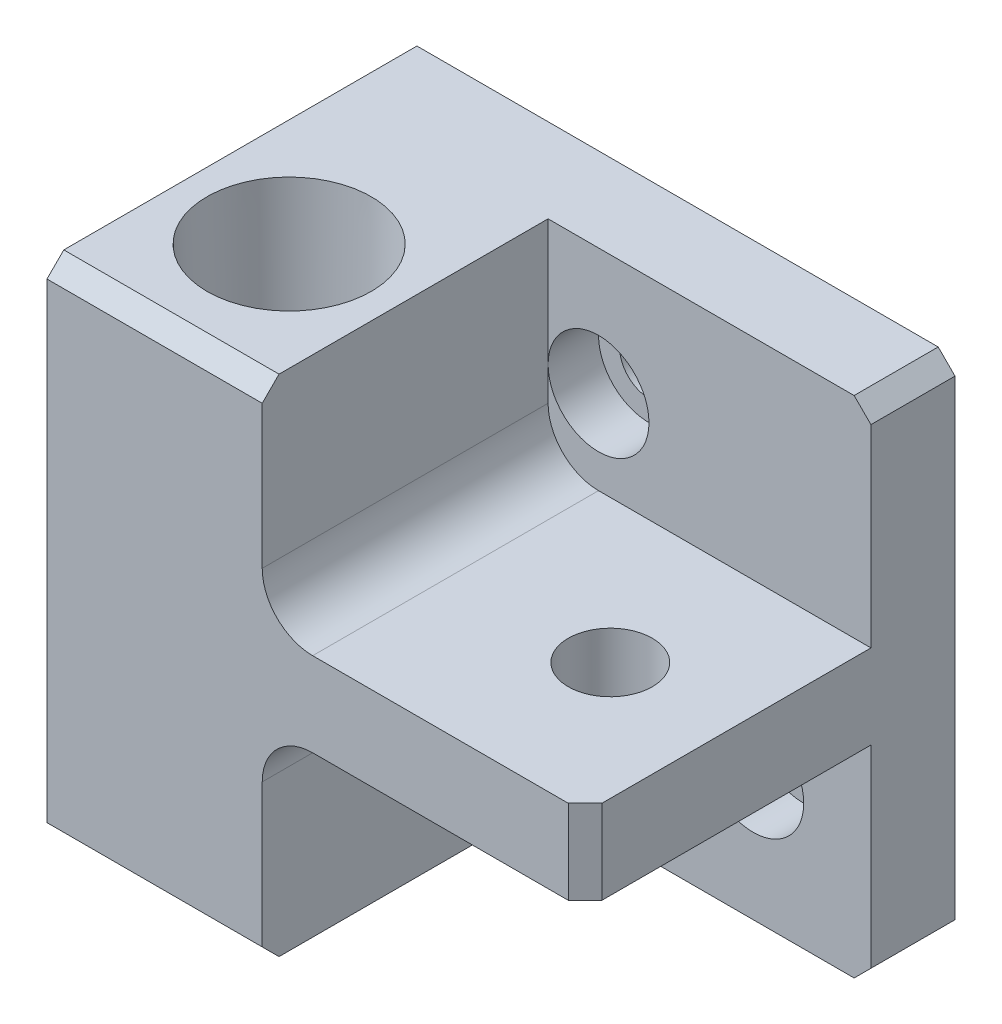
ISO-10303-21;
HEADER;
FILE_DESCRIPTION(('STEP AP214'),'2;1');
FILE_NAME('part.step','',(''),(''),'','','');
FILE_SCHEMA(('AUTOMOTIVE_DESIGN { 1 0 10303 214 1 1 1 1 }'));
ENDSEC;
DATA;
#1=APPLICATION_CONTEXT('core data for automotive mechanical design processes');
#2=APPLICATION_PROTOCOL_DEFINITION('international standard','automotive_design',2000,#1);
#3=PRODUCT_CONTEXT('',#1,'mechanical');
#4=PRODUCT('Part','Part','',(#3));
#5=PRODUCT_RELATED_PRODUCT_CATEGORY('part','',(#4));
#6=PRODUCT_DEFINITION_FORMATION('','',#4);
#7=PRODUCT_DEFINITION_CONTEXT('part definition',#1,'design');
#8=PRODUCT_DEFINITION('design','',#6,#7);
#9=PRODUCT_DEFINITION_SHAPE('','',#8);
#10=(LENGTH_UNIT() NAMED_UNIT(*) SI_UNIT(.MILLI.,.METRE.));
#11=(NAMED_UNIT(*) PLANE_ANGLE_UNIT() SI_UNIT($,.RADIAN.));
#12=(NAMED_UNIT(*) SI_UNIT($,.STERADIAN.) SOLID_ANGLE_UNIT());
#13=UNCERTAINTY_MEASURE_WITH_UNIT(LENGTH_MEASURE(1.E-05),#10,'distance_accuracy_value','');
#14=(GEOMETRIC_REPRESENTATION_CONTEXT(3) GLOBAL_UNCERTAINTY_ASSIGNED_CONTEXT((#13)) GLOBAL_UNIT_ASSIGNED_CONTEXT((#10,
#11,#12)) REPRESENTATION_CONTEXT('',''));
#15=CARTESIAN_POINT('',(0.,0.,0.));
#16=DIRECTION('',(0.,0.,1.));
#17=DIRECTION('',(1.,0.,0.));
#18=AXIS2_PLACEMENT_3D('',#15,#16,#17);
#19=CARTESIAN_POINT('',(16.,-15.,11.));
#20=DIRECTION('',(-1.,0.,0.));
#21=DIRECTION('',(0.,0.,1.));
#22=AXIS2_PLACEMENT_3D('',#19,#20,#21);
#23=PLANE('',#22);
#24=DIRECTION('',(0.,0.,1.));
#25=VECTOR('',#24,1.);
#26=CARTESIAN_POINT('',(16.,2.5,-33.9104779522384));
#27=LINE('',#26,#25);
#28=CARTESIAN_POINT('',(16.,2.5,-6.));
#29=VERTEX_POINT('',#28);
#30=CARTESIAN_POINT('',(16.,2.5,9.99999999999998));
#31=VERTEX_POINT('',#30);
#32=EDGE_CURVE('E175',#29,#31,#27,.T.);
#33=ORIENTED_EDGE('',*,*,#32,.T.);
#34=DIRECTION('',(0.,-1.,0.));
#35=VECTOR('',#34,1.);
#36=CARTESIAN_POINT('',(16.,-15.,9.99999999999998));
#37=LINE('',#36,#35);
#38=CARTESIAN_POINT('',(16.,-2.5,9.99999999999997));
#39=VERTEX_POINT('',#38);
#40=EDGE_CURVE('E310',#31,#39,#37,.T.);
#41=ORIENTED_EDGE('',*,*,#40,.T.);
#42=DIRECTION('',(0.,0.,1.));
#43=VECTOR('',#42,1.);
#44=CARTESIAN_POINT('',(16.,-2.5,-33.9104779522384));
#45=LINE('',#44,#43);
#46=CARTESIAN_POINT('',(16.,-2.5,-6.));
#47=VERTEX_POINT('',#46);
#48=EDGE_CURVE('E209',#47,#39,#45,.T.);
#49=ORIENTED_EDGE('',*,*,#48,.F.);
#50=DIRECTION('',(0.,1.,0.));
#51=VECTOR('',#50,1.);
#52=CARTESIAN_POINT('',(16.,-15.,-6.));
#53=LINE('',#52,#51);
#54=CARTESIAN_POINT('',(16.,-14.,-6.));
#55=VERTEX_POINT('',#54);
#56=EDGE_CURVE('E207',#55,#47,#53,.T.);
#57=ORIENTED_EDGE('',*,*,#56,.F.);
#58=DIRECTION('',(0.,0.,-1.));
#59=VECTOR('',#58,1.);
#60=CARTESIAN_POINT('',(16.,-14.,11.));
#61=LINE('',#60,#59);
#62=CARTESIAN_POINT('',(16.,-14.,-11.));
#63=VERTEX_POINT('',#62);
#64=EDGE_CURVE('E307',#55,#63,#61,.T.);
#65=ORIENTED_EDGE('',*,*,#64,.T.);
#66=DIRECTION('',(0.,1.,0.));
#67=VECTOR('',#66,1.);
#68=CARTESIAN_POINT('',(16.,-15.,-11.));
#69=LINE('',#68,#67);
#70=CARTESIAN_POINT('',(16.,14.,-11.));
#71=VERTEX_POINT('',#70);
#72=EDGE_CURVE('E250',#63,#71,#69,.T.);
#73=ORIENTED_EDGE('',*,*,#72,.T.);
#74=DIRECTION('',(0.,0.,1.));
#75=VECTOR('',#74,1.);
#76=CARTESIAN_POINT('',(16.,14.,11.));
#77=LINE('',#76,#75);
#78=CARTESIAN_POINT('',(16.,14.,-6.));
#79=VERTEX_POINT('',#78);
#80=EDGE_CURVE('E187',#71,#79,#77,.T.);
#81=ORIENTED_EDGE('',*,*,#80,.T.);
#82=DIRECTION('',(0.,1.,0.));
#83=VECTOR('',#82,1.);
#84=CARTESIAN_POINT('',(16.,15.,-6.));
#85=LINE('',#84,#83);
#86=EDGE_CURVE('E168',#29,#79,#85,.T.);
#87=ORIENTED_EDGE('',*,*,#86,.F.);
#88=EDGE_LOOP('',(#33,#41,#49,#57,#65,#73,#81,#87));
#89=FACE_BOUND('',#88,.T.);
#90=ADVANCED_FACE('F39',(#89),#23,.F.);
#91=CARTESIAN_POINT('',(-16.,15.,11.));
#92=DIRECTION('',(0.,-1.,0.));
#93=DIRECTION('',(0.,0.,-1.));
#94=AXIS2_PLACEMENT_3D('',#91,#92,#93);
#95=PLANE('',#94);
#96=CARTESIAN_POINT('',(-9.59999999999999,15.,3.));
#97=DIRECTION('',(0.,1.,0.));
#98=DIRECTION('',(0.,0.,1.));
#99=AXIS2_PLACEMENT_3D('',#96,#97,#98);
#100=CIRCLE('',#99,4.88273);
#101=CARTESIAN_POINT('',(-9.59999999999999,15.,7.88273));
#102=VERTEX_POINT('',#101);
#103=EDGE_CURVE('E740',#102,#102,#100,.T.);
#104=ORIENTED_EDGE('',*,*,#103,.F.);
#105=EDGE_LOOP('',(#104));
#106=FACE_BOUND('',#105,.T.);
#107=DIRECTION('',(0.,0.,-1.));
#108=VECTOR('',#107,1.);
#109=CARTESIAN_POINT('',(-16.,15.,11.));
#110=LINE('',#109,#108);
#111=CARTESIAN_POINT('',(-16.,15.,10.));
#112=VERTEX_POINT('',#111);
#113=CARTESIAN_POINT('',(-16.,15.,-11.));
#114=VERTEX_POINT('',#113);
#115=EDGE_CURVE('E265',#112,#114,#110,.T.);
#116=ORIENTED_EDGE('',*,*,#115,.F.);
#117=DIRECTION('',(1.,0.,0.));
#118=VECTOR('',#117,1.);
#119=CARTESIAN_POINT('',(-16.,15.,10.));
#120=LINE('',#119,#118);
#121=CARTESIAN_POINT('',(-3.19999999999998,15.,9.99999999999998));
#122=VERTEX_POINT('',#121);
#123=EDGE_CURVE('E301',#112,#122,#120,.T.);
#124=ORIENTED_EDGE('',*,*,#123,.T.);
#125=DIRECTION('',(0.,0.,1.));
#126=VECTOR('',#125,1.);
#127=CARTESIAN_POINT('',(-3.19999999999998,15.,-33.9104779522384));
#128=LINE('',#127,#126);
#129=CARTESIAN_POINT('',(-3.19999999999998,15.,-6.));
#130=VERTEX_POINT('',#129);
#131=EDGE_CURVE('E190',#130,#122,#128,.T.);
#132=ORIENTED_EDGE('',*,*,#131,.F.);
#133=DIRECTION('',(-1.,0.,0.));
#134=VECTOR('',#133,1.);
#135=CARTESIAN_POINT('',(-3.19999999999998,15.,-6.));
#136=LINE('',#135,#134);
#137=CARTESIAN_POINT('',(15.,15.,-6.));
#138=VERTEX_POINT('',#137);
#139=EDGE_CURVE('E188',#138,#130,#136,.T.);
#140=ORIENTED_EDGE('',*,*,#139,.F.);
#141=DIRECTION('',(0.,0.,-1.));
#142=VECTOR('',#141,1.);
#143=CARTESIAN_POINT('',(15.,15.,11.));
#144=LINE('',#143,#142);
#145=CARTESIAN_POINT('',(15.,15.,-11.));
#146=VERTEX_POINT('',#145);
#147=EDGE_CURVE('E298',#138,#146,#144,.T.);
#148=ORIENTED_EDGE('',*,*,#147,.T.);
#149=DIRECTION('',(-1.,0.,0.));
#150=VECTOR('',#149,1.);
#151=CARTESIAN_POINT('',(-16.,15.,-11.));
#152=LINE('',#151,#150);
#153=EDGE_CURVE('E257',#146,#114,#152,.T.);
#154=ORIENTED_EDGE('',*,*,#153,.T.);
#155=EDGE_LOOP('',(#116,#124,#132,#140,#148,#154));
#156=FACE_BOUND('',#155,.T.);
#157=ADVANCED_FACE('F376',(#106,#156),#95,.F.);
#158=CARTESIAN_POINT('',(-16.,-15.,11.));
#159=DIRECTION('',(1.,0.,0.));
#160=DIRECTION('',(0.,0.,-1.));
#161=AXIS2_PLACEMENT_3D('',#158,#159,#160);
#162=PLANE('',#161);
#163=DIRECTION('',(0.,0.,-1.));
#164=VECTOR('',#163,1.);
#165=CARTESIAN_POINT('',(-16.,-15.,11.));
#166=LINE('',#165,#164);
#167=CARTESIAN_POINT('',(-16.,-15.,10.));
#168=VERTEX_POINT('',#167);
#169=CARTESIAN_POINT('',(-16.,-15.,-11.));
#170=VERTEX_POINT('',#169);
#171=EDGE_CURVE('E254',#168,#170,#166,.T.);
#172=ORIENTED_EDGE('',*,*,#171,.F.);
#173=DIRECTION('',(0.,-0.707106781186548,-0.707106781186548));
#174=VECTOR('',#173,1.);
#175=CARTESIAN_POINT('',(-16.,-14.,11.));
#176=LINE('',#175,#174);
#177=CARTESIAN_POINT('',(-16.,-14.,11.));
#178=VERTEX_POINT('',#177);
#179=EDGE_CURVE('E296',#168,#178,#176,.F.);
#180=ORIENTED_EDGE('',*,*,#179,.T.);
#181=DIRECTION('',(0.,-1.,0.));
#182=VECTOR('',#181,1.);
#183=CARTESIAN_POINT('',(-16.,-15.,11.));
#184=LINE('',#183,#182);
#185=CARTESIAN_POINT('',(-16.,14.,11.));
#186=VERTEX_POINT('',#185);
#187=EDGE_CURVE('E251',#186,#178,#184,.T.);
#188=ORIENTED_EDGE('',*,*,#187,.F.);
#189=DIRECTION('',(0.,-0.707106781186548,0.707106781186548));
#190=VECTOR('',#189,1.);
#191=CARTESIAN_POINT('',(-16.,14.,11.));
#192=LINE('',#191,#190);
#193=EDGE_CURVE('E294',#186,#112,#192,.F.);
#194=ORIENTED_EDGE('',*,*,#193,.T.);
#195=ORIENTED_EDGE('',*,*,#115,.T.);
#196=DIRECTION('',(0.,-1.,0.));
#197=VECTOR('',#196,1.);
#198=CARTESIAN_POINT('',(-16.,-15.,-11.));
#199=LINE('',#198,#197);
#200=EDGE_CURVE('E259',#114,#170,#199,.T.);
#201=ORIENTED_EDGE('',*,*,#200,.T.);
#202=EDGE_LOOP('',(#172,#180,#188,#194,#195,#201));
#203=FACE_BOUND('',#202,.T.);
#204=ADVANCED_FACE('F381',(#203),#162,.F.);
#205=CARTESIAN_POINT('',(-16.,-15.,11.));
#206=DIRECTION('',(0.,1.,0.));
#207=DIRECTION('',(0.,0.,1.));
#208=AXIS2_PLACEMENT_3D('',#205,#206,#207);
#209=PLANE('',#208);
#210=CARTESIAN_POINT('',(-9.59999999999999,-15.,3.));
#211=DIRECTION('',(0.,-1.,0.));
#212=DIRECTION('',(0.,0.,-1.));
#213=AXIS2_PLACEMENT_3D('',#210,#211,#212);
#214=CIRCLE('',#213,4.945163);
#215=CARTESIAN_POINT('',(-9.59999999999999,-15.,-1.945163));
#216=VERTEX_POINT('',#215);
#217=EDGE_CURVE('E729',#216,#216,#214,.T.);
#218=ORIENTED_EDGE('',*,*,#217,.F.);
#219=EDGE_LOOP('',(#218));
#220=FACE_BOUND('',#219,.T.);
#221=DIRECTION('',(0.,0.,1.));
#222=VECTOR('',#221,1.);
#223=CARTESIAN_POINT('',(-3.19999999999998,-15.,-33.9104779522384));
#224=LINE('',#223,#222);
#225=CARTESIAN_POINT('',(-3.19999999999998,-15.,-6.));
#226=VERTEX_POINT('',#225);
#227=CARTESIAN_POINT('',(-3.19999999999998,-15.,9.99999999999999));
#228=VERTEX_POINT('',#227);
#229=EDGE_CURVE('E213',#226,#228,#224,.T.);
#230=ORIENTED_EDGE('',*,*,#229,.T.);
#231=DIRECTION('',(-1.,0.,0.));
#232=VECTOR('',#231,1.);
#233=CARTESIAN_POINT('',(-16.,-15.,10.));
#234=LINE('',#233,#232);
#235=EDGE_CURVE('E292',#228,#168,#234,.T.);
#236=ORIENTED_EDGE('',*,*,#235,.T.);
#237=ORIENTED_EDGE('',*,*,#171,.T.);
#238=DIRECTION('',(1.,0.,0.));
#239=VECTOR('',#238,1.);
#240=CARTESIAN_POINT('',(-16.,-15.,-11.));
#241=LINE('',#240,#239);
#242=CARTESIAN_POINT('',(15.,-15.,-11.));
#243=VERTEX_POINT('',#242);
#244=EDGE_CURVE('E255',#170,#243,#241,.T.);
#245=ORIENTED_EDGE('',*,*,#244,.T.);
#246=DIRECTION('',(0.,0.,1.));
#247=VECTOR('',#246,1.);
#248=CARTESIAN_POINT('',(15.,-15.,11.));
#249=LINE('',#248,#247);
#250=CARTESIAN_POINT('',(15.,-15.,-6.));
#251=VERTEX_POINT('',#250);
#252=EDGE_CURVE('E290',#243,#251,#249,.T.);
#253=ORIENTED_EDGE('',*,*,#252,.T.);
#254=DIRECTION('',(1.,0.,0.));
#255=VECTOR('',#254,1.);
#256=CARTESIAN_POINT('',(16.,-15.,-6.));
#257=LINE('',#256,#255);
#258=EDGE_CURVE('E210',#226,#251,#257,.T.);
#259=ORIENTED_EDGE('',*,*,#258,.F.);
#260=EDGE_LOOP('',(#230,#236,#237,#245,#253,#259));
#261=FACE_BOUND('',#260,.T.);
#262=ADVANCED_FACE('F436',(#220,#261),#209,.F.);
#263=CARTESIAN_POINT('',(0.,0.,11.));
#264=DIRECTION('',(0.,0.,-1.));
#265=DIRECTION('',(-1.,0.,0.));
#266=AXIS2_PLACEMENT_3D('',#263,#264,#265);
#267=PLANE('',#266);
#268=ORIENTED_EDGE('',*,*,#187,.T.);
#269=DIRECTION('',(1.,0.,0.));
#270=VECTOR('',#269,1.);
#271=CARTESIAN_POINT('',(0.,-14.,11.));
#272=LINE('',#271,#270);
#273=CARTESIAN_POINT('',(-3.19999999999998,-14.,11.));
#274=VERTEX_POINT('',#273);
#275=EDGE_CURVE('E285',#178,#274,#272,.T.);
#276=ORIENTED_EDGE('',*,*,#275,.T.);
#277=DIRECTION('',(0.,-1.,0.));
#278=VECTOR('',#277,1.);
#279=CARTESIAN_POINT('',(-3.19999999999998,-15.,11.));
#280=LINE('',#279,#278);
#281=CARTESIAN_POINT('',(-3.19999999999998,-5.50000000000001,11.));
#282=VERTEX_POINT('',#281);
#283=EDGE_CURVE('E197',#282,#274,#280,.T.);
#284=ORIENTED_EDGE('',*,*,#283,.F.);
#285=CARTESIAN_POINT('',(-0.199999999999983,-5.5,11.));
#286=DIRECTION('',(0.,0.,-1.));
#287=DIRECTION('',(-1.,0.,0.));
#288=AXIS2_PLACEMENT_3D('',#285,#286,#287);
#289=CIRCLE('',#288,3.);
#290=CARTESIAN_POINT('',(-0.199999999999985,-2.5,11.));
#291=VERTEX_POINT('',#290);
#292=EDGE_CURVE('E47',#282,#291,#289,.T.);
#293=ORIENTED_EDGE('',*,*,#292,.T.);
#294=DIRECTION('',(-1.,0.,0.));
#295=VECTOR('',#294,1.);
#296=CARTESIAN_POINT('',(16.,-2.5,11.));
#297=LINE('',#296,#295);
#298=CARTESIAN_POINT('',(15.,-2.5,11.));
#299=VERTEX_POINT('',#298);
#300=EDGE_CURVE('E200',#299,#291,#297,.T.);
#301=ORIENTED_EDGE('',*,*,#300,.F.);
#302=DIRECTION('',(0.,1.,0.));
#303=VECTOR('',#302,1.);
#304=CARTESIAN_POINT('',(15.,0.,11.));
#305=LINE('',#304,#303);
#306=CARTESIAN_POINT('',(15.,2.5,11.));
#307=VERTEX_POINT('',#306);
#308=EDGE_CURVE('E274',#299,#307,#305,.T.);
#309=ORIENTED_EDGE('',*,*,#308,.T.);
#310=DIRECTION('',(1.,0.,0.));
#311=VECTOR('',#310,1.);
#312=CARTESIAN_POINT('',(-3.19999999999998,2.5,11.));
#313=LINE('',#312,#311);
#314=CARTESIAN_POINT('',(-0.199999999999984,2.5,11.));
#315=VERTEX_POINT('',#314);
#316=EDGE_CURVE('E176',#315,#307,#313,.T.);
#317=ORIENTED_EDGE('',*,*,#316,.F.);
#318=CARTESIAN_POINT('',(-0.199999999999983,5.5,11.));
#319=DIRECTION('',(0.,0.,-1.));
#320=DIRECTION('',(-1.,0.,0.));
#321=AXIS2_PLACEMENT_3D('',#318,#319,#320);
#322=CIRCLE('',#321,3.);
#323=CARTESIAN_POINT('',(-3.19999999999998,5.50000000000001,11.));
#324=VERTEX_POINT('',#323);
#325=EDGE_CURVE('E12',#315,#324,#322,.T.);
#326=ORIENTED_EDGE('',*,*,#325,.T.);
#327=DIRECTION('',(0.,-1.,0.));
#328=VECTOR('',#327,1.);
#329=CARTESIAN_POINT('',(-3.19999999999998,15.,11.));
#330=LINE('',#329,#328);
#331=CARTESIAN_POINT('',(-3.19999999999998,14.,11.));
#332=VERTEX_POINT('',#331);
#333=EDGE_CURVE('E278',#332,#324,#330,.T.);
#334=ORIENTED_EDGE('',*,*,#333,.F.);
#335=DIRECTION('',(-1.,0.,0.));
#336=VECTOR('',#335,1.);
#337=CARTESIAN_POINT('',(0.,14.,11.));
#338=LINE('',#337,#336);
#339=EDGE_CURVE('E282',#332,#186,#338,.T.);
#340=ORIENTED_EDGE('',*,*,#339,.T.);
#341=EDGE_LOOP('',(#268,#276,#284,#293,#301,#309,#317,#326,#334,#340));
#342=FACE_BOUND('',#341,.T.);
#343=ADVANCED_FACE('F334',(#342),#267,.F.);
#344=CARTESIAN_POINT('',(0.,0.,-11.));
#345=DIRECTION('',(0.,0.,-1.));
#346=DIRECTION('',(-1.,0.,0.));
#347=AXIS2_PLACEMENT_3D('',#344,#345,#346);
#348=PLANE('',#347);
#349=CARTESIAN_POINT('',(-0.19999999999999,7.5,-11.));
#350=DIRECTION('',(0.,0.,1.));
#351=DIRECTION('',(1.,0.,0.));
#352=AXIS2_PLACEMENT_3D('',#349,#350,#351);
#353=CIRCLE('',#352,1.74999999999999);
#354=CARTESIAN_POINT('',(1.55,7.5,-11.));
#355=VERTEX_POINT('',#354);
#356=EDGE_CURVE('E229',#355,#355,#353,.T.);
#357=ORIENTED_EDGE('',*,*,#356,.T.);
#358=EDGE_LOOP('',(#357));
#359=FACE_BOUND('',#358,.T.);
#360=CARTESIAN_POINT('',(-0.19999999999999,-7.5,-11.));
#361=DIRECTION('',(0.,0.,1.));
#362=DIRECTION('',(1.,0.,0.));
#363=AXIS2_PLACEMENT_3D('',#360,#361,#362);
#364=CIRCLE('',#363,1.74999999999999);
#365=CARTESIAN_POINT('',(1.55,-7.5,-11.));
#366=VERTEX_POINT('',#365);
#367=EDGE_CURVE('E238',#366,#366,#364,.T.);
#368=ORIENTED_EDGE('',*,*,#367,.T.);
#369=EDGE_LOOP('',(#368));
#370=FACE_BOUND('',#369,.T.);
#371=CARTESIAN_POINT('',(9.00000000000001,-7.5,-11.));
#372=DIRECTION('',(0.,0.,1.));
#373=DIRECTION('',(1.,0.,0.));
#374=AXIS2_PLACEMENT_3D('',#371,#372,#373);
#375=CIRCLE('',#374,1.74999999999999);
#376=CARTESIAN_POINT('',(10.75,-7.5,-11.));
#377=VERTEX_POINT('',#376);
#378=EDGE_CURVE('E247',#377,#377,#375,.T.);
#379=ORIENTED_EDGE('',*,*,#378,.T.);
#380=EDGE_LOOP('',(#379));
#381=FACE_BOUND('',#380,.T.);
#382=ORIENTED_EDGE('',*,*,#72,.F.);
#383=DIRECTION('',(0.707106781186548,0.707106781186548,0.));
#384=VECTOR('',#383,1.);
#385=CARTESIAN_POINT('',(15.,-15.,-11.));
#386=LINE('',#385,#384);
#387=EDGE_CURVE('E316',#63,#243,#386,.F.);
#388=ORIENTED_EDGE('',*,*,#387,.T.);
#389=ORIENTED_EDGE('',*,*,#244,.F.);
#390=ORIENTED_EDGE('',*,*,#200,.F.);
#391=ORIENTED_EDGE('',*,*,#153,.F.);
#392=DIRECTION('',(-0.707106781186545,0.70710678118655,0.));
#393=VECTOR('',#392,1.);
#394=CARTESIAN_POINT('',(15.0000000000001,14.9999999999999,-11.));
#395=LINE('',#394,#393);
#396=EDGE_CURVE('E314',#146,#71,#395,.F.);
#397=ORIENTED_EDGE('',*,*,#396,.T.);
#398=EDGE_LOOP('',(#382,#388,#389,#390,#391,#397));
#399=FACE_BOUND('',#398,.T.);
#400=ADVANCED_FACE('F444',(#359,#370,#381,#399),#348,.T.);
#401=CARTESIAN_POINT('',(9.00000000000001,-7.5,11.));
#402=DIRECTION('',(0.,0.,1.));
#403=DIRECTION('',(1.,0.,0.));
#404=AXIS2_PLACEMENT_3D('',#401,#402,#403);
#405=CYLINDRICAL_SURFACE('',#404,1.74999999999999);
#406=ORIENTED_EDGE('',*,*,#378,.F.);
#407=EDGE_LOOP('',(#406));
#408=FACE_BOUND('',#407,.T.);
#409=CARTESIAN_POINT('',(9.00000000000001,-7.5,-9.));
#410=DIRECTION('',(0.,0.,1.));
#411=DIRECTION('',(1.,0.,0.));
#412=AXIS2_PLACEMENT_3D('',#409,#410,#411);
#413=CIRCLE('',#412,1.74999999999999);
#414=CARTESIAN_POINT('',(10.75,-7.5,-9.));
#415=VERTEX_POINT('',#414);
#416=EDGE_CURVE('E244',#415,#415,#413,.T.);
#417=ORIENTED_EDGE('',*,*,#416,.T.);
#418=EDGE_LOOP('',(#417));
#419=FACE_BOUND('',#418,.T.);
#420=ADVANCED_FACE('F449',(#408,#419),#405,.F.);
#421=CARTESIAN_POINT('',(10.75,-7.5,-9.));
#422=DIRECTION('',(0.,0.,-1.));
#423=DIRECTION('',(-1.,0.,0.));
#424=AXIS2_PLACEMENT_3D('',#421,#422,#423);
#425=PLANE('',#424);
#426=ORIENTED_EDGE('',*,*,#416,.F.);
#427=EDGE_LOOP('',(#426));
#428=FACE_BOUND('',#427,.T.);
#429=CARTESIAN_POINT('',(9.00000000000001,-7.5,-9.));
#430=DIRECTION('',(0.,0.,1.));
#431=DIRECTION('',(1.,0.,0.));
#432=AXIS2_PLACEMENT_3D('',#429,#430,#431);
#433=CIRCLE('',#432,3.);
#434=CARTESIAN_POINT('',(12.,-7.5,-9.));
#435=VERTEX_POINT('',#434);
#436=EDGE_CURVE('E241',#435,#435,#433,.T.);
#437=ORIENTED_EDGE('',*,*,#436,.T.);
#438=EDGE_LOOP('',(#437));
#439=FACE_BOUND('',#438,.T.);
#440=ADVANCED_FACE('F456',(#428,#439),#425,.F.);
#441=CARTESIAN_POINT('',(9.00000000000001,-7.5,11.));
#442=DIRECTION('',(0.,0.,1.));
#443=DIRECTION('',(1.,0.,0.));
#444=AXIS2_PLACEMENT_3D('',#441,#442,#443);
#445=CYLINDRICAL_SURFACE('',#444,3.);
#446=CARTESIAN_POINT('',(9.00000000000001,-7.5,-6.));
#447=DIRECTION('',(0.,0.,-1.));
#448=DIRECTION('',(-1.,0.,0.));
#449=AXIS2_PLACEMENT_3D('',#446,#447,#448);
#450=CIRCLE('',#449,3.);
#451=CARTESIAN_POINT('',(6.00000000000001,-7.5,-6.));
#452=VERTEX_POINT('',#451);
#453=EDGE_CURVE('E220',#452,#452,#450,.F.);
#454=ORIENTED_EDGE('',*,*,#453,.T.);
#455=EDGE_LOOP('',(#454));
#456=FACE_BOUND('',#455,.T.);
#457=ORIENTED_EDGE('',*,*,#436,.F.);
#458=EDGE_LOOP('',(#457));
#459=FACE_BOUND('',#458,.T.);
#460=ADVANCED_FACE('F371',(#456,#459),#445,.F.);
#461=CARTESIAN_POINT('',(-0.19999999999999,-7.5,11.));
#462=DIRECTION('',(0.,0.,1.));
#463=DIRECTION('',(1.,0.,0.));
#464=AXIS2_PLACEMENT_3D('',#461,#462,#463);
#465=CYLINDRICAL_SURFACE('',#464,1.75);
#466=ORIENTED_EDGE('',*,*,#367,.F.);
#467=EDGE_LOOP('',(#466));
#468=FACE_BOUND('',#467,.T.);
#469=CARTESIAN_POINT('',(-0.19999999999999,-7.5,-9.));
#470=DIRECTION('',(0.,0.,1.));
#471=DIRECTION('',(1.,0.,0.));
#472=AXIS2_PLACEMENT_3D('',#469,#470,#471);
#473=CIRCLE('',#472,1.75);
#474=CARTESIAN_POINT('',(1.55000000000001,-7.5,-9.));
#475=VERTEX_POINT('',#474);
#476=EDGE_CURVE('E235',#475,#475,#473,.T.);
#477=ORIENTED_EDGE('',*,*,#476,.T.);
#478=EDGE_LOOP('',(#477));
#479=FACE_BOUND('',#478,.T.);
#480=ADVANCED_FACE('F365',(#468,#479),#465,.F.);
#481=CARTESIAN_POINT('',(1.55000000000001,-7.5,-9.));
#482=DIRECTION('',(0.,0.,-1.));
#483=DIRECTION('',(-1.,0.,0.));
#484=AXIS2_PLACEMENT_3D('',#481,#482,#483);
#485=PLANE('',#484);
#486=ORIENTED_EDGE('',*,*,#476,.F.);
#487=EDGE_LOOP('',(#486));
#488=FACE_BOUND('',#487,.T.);
#489=CARTESIAN_POINT('',(-0.19999999999999,-7.5,-9.));
#490=DIRECTION('',(0.,0.,1.));
#491=DIRECTION('',(1.,0.,0.));
#492=AXIS2_PLACEMENT_3D('',#489,#490,#491);
#493=CIRCLE('',#492,3.);
#494=CARTESIAN_POINT('',(2.80000000000001,-7.5,-9.));
#495=VERTEX_POINT('',#494);
#496=EDGE_CURVE('E232',#495,#495,#493,.T.);
#497=ORIENTED_EDGE('',*,*,#496,.T.);
#498=EDGE_LOOP('',(#497));
#499=FACE_BOUND('',#498,.T.);
#500=ADVANCED_FACE('F360',(#488,#499),#485,.F.);
#501=CARTESIAN_POINT('',(-0.19999999999999,-7.5,11.));
#502=DIRECTION('',(0.,0.,1.));
#503=DIRECTION('',(1.,0.,0.));
#504=AXIS2_PLACEMENT_3D('',#501,#502,#503);
#505=CYLINDRICAL_SURFACE('',#504,3.);
#506=CARTESIAN_POINT('',(-0.19999999999999,-7.5,-6.));
#507=DIRECTION('',(0.,0.,-1.));
#508=DIRECTION('',(-1.,0.,0.));
#509=AXIS2_PLACEMENT_3D('',#506,#507,#508);
#510=CIRCLE('',#509,3.);
#511=CARTESIAN_POINT('',(-3.19999999999999,-7.5,-6.));
#512=VERTEX_POINT('',#511);
#513=EDGE_CURVE('E268',#512,#512,#510,.F.);
#514=ORIENTED_EDGE('',*,*,#513,.T.);
#515=EDGE_LOOP('',(#514));
#516=FACE_BOUND('',#515,.T.);
#517=ORIENTED_EDGE('',*,*,#496,.F.);
#518=EDGE_LOOP('',(#517));
#519=FACE_BOUND('',#518,.T.);
#520=ADVANCED_FACE('F356',(#516,#519),#505,.F.);
#521=CARTESIAN_POINT('',(-0.19999999999999,7.5,11.));
#522=DIRECTION('',(0.,0.,1.));
#523=DIRECTION('',(1.,0.,0.));
#524=AXIS2_PLACEMENT_3D('',#521,#522,#523);
#525=CYLINDRICAL_SURFACE('',#524,1.75);
#526=ORIENTED_EDGE('',*,*,#356,.F.);
#527=EDGE_LOOP('',(#526));
#528=FACE_BOUND('',#527,.T.);
#529=CARTESIAN_POINT('',(-0.19999999999999,7.5,-9.));
#530=DIRECTION('',(0.,0.,1.));
#531=DIRECTION('',(1.,0.,0.));
#532=AXIS2_PLACEMENT_3D('',#529,#530,#531);
#533=CIRCLE('',#532,1.75);
#534=CARTESIAN_POINT('',(1.55000000000001,7.5,-9.));
#535=VERTEX_POINT('',#534);
#536=EDGE_CURVE('E226',#535,#535,#533,.T.);
#537=ORIENTED_EDGE('',*,*,#536,.T.);
#538=EDGE_LOOP('',(#537));
#539=FACE_BOUND('',#538,.T.);
#540=ADVANCED_FACE('F359',(#528,#539),#525,.F.);
#541=CARTESIAN_POINT('',(1.55000000000001,7.5,-9.));
#542=DIRECTION('',(0.,0.,-1.));
#543=DIRECTION('',(-1.,0.,0.));
#544=AXIS2_PLACEMENT_3D('',#541,#542,#543);
#545=PLANE('',#544);
#546=ORIENTED_EDGE('',*,*,#536,.F.);
#547=EDGE_LOOP('',(#546));
#548=FACE_BOUND('',#547,.T.);
#549=CARTESIAN_POINT('',(-0.19999999999999,7.5,-9.));
#550=DIRECTION('',(0.,0.,1.));
#551=DIRECTION('',(1.,0.,0.));
#552=AXIS2_PLACEMENT_3D('',#549,#550,#551);
#553=CIRCLE('',#552,3.);
#554=CARTESIAN_POINT('',(2.80000000000001,7.5,-9.));
#555=VERTEX_POINT('',#554);
#556=EDGE_CURVE('E223',#555,#555,#553,.T.);
#557=ORIENTED_EDGE('',*,*,#556,.T.);
#558=EDGE_LOOP('',(#557));
#559=FACE_BOUND('',#558,.T.);
#560=ADVANCED_FACE('F631',(#548,#559),#545,.F.);
#561=CARTESIAN_POINT('',(-0.19999999999999,7.5,11.));
#562=DIRECTION('',(0.,0.,1.));
#563=DIRECTION('',(1.,0.,0.));
#564=AXIS2_PLACEMENT_3D('',#561,#562,#563);
#565=CYLINDRICAL_SURFACE('',#564,3.);
#566=CARTESIAN_POINT('',(-0.19999999999999,7.5,-6.));
#567=DIRECTION('',(0.,0.,-1.));
#568=DIRECTION('',(-1.,0.,0.));
#569=AXIS2_PLACEMENT_3D('',#566,#567,#568);
#570=CIRCLE('',#569,3.);
#571=CARTESIAN_POINT('',(-3.19999999999999,7.5,-6.));
#572=VERTEX_POINT('',#571);
#573=EDGE_CURVE('E271',#572,#572,#570,.F.);
#574=ORIENTED_EDGE('',*,*,#573,.T.);
#575=EDGE_LOOP('',(#574));
#576=FACE_BOUND('',#575,.T.);
#577=ORIENTED_EDGE('',*,*,#556,.F.);
#578=EDGE_LOOP('',(#577));
#579=FACE_BOUND('',#578,.T.);
#580=ADVANCED_FACE('F491',(#576,#579),#565,.F.);
#581=CARTESIAN_POINT('',(0.,0.,-6.));
#582=DIRECTION('',(0.,0.,-1.));
#583=DIRECTION('',(-1.,0.,0.));
#584=AXIS2_PLACEMENT_3D('',#581,#582,#583);
#585=PLANE('',#584);
#586=DIRECTION('',(-1.,0.,0.));
#587=VECTOR('',#586,1.);
#588=CARTESIAN_POINT('',(16.,-2.5,-6.));
#589=LINE('',#588,#587);
#590=CARTESIAN_POINT('',(-0.199999999999985,-2.5,-6.));
#591=VERTEX_POINT('',#590);
#592=EDGE_CURVE('E199',#47,#591,#589,.T.);
#593=ORIENTED_EDGE('',*,*,#592,.T.);
#594=CARTESIAN_POINT('',(-0.199999999999983,-5.5,-6.));
#595=DIRECTION('',(0.,0.,-1.));
#596=DIRECTION('',(-1.,0.,0.));
#597=AXIS2_PLACEMENT_3D('',#594,#595,#596);
#598=CIRCLE('',#597,3.);
#599=CARTESIAN_POINT('',(-3.19999999999998,-5.5,-6.));
#600=VERTEX_POINT('',#599);
#601=EDGE_CURVE('E327',#591,#600,#598,.F.);
#602=ORIENTED_EDGE('',*,*,#601,.T.);
#603=DIRECTION('',(0.,-1.,0.));
#604=VECTOR('',#603,1.);
#605=CARTESIAN_POINT('',(-3.19999999999998,-15.,-6.));
#606=LINE('',#605,#604);
#607=EDGE_CURVE('E214',#600,#512,#606,.T.);
#608=ORIENTED_EDGE('',*,*,#607,.T.);
#609=ORIENTED_EDGE('',*,*,#513,.F.);
#610=EDGE_CURVE('E206',#512,#226,#606,.T.);
#611=ORIENTED_EDGE('',*,*,#610,.T.);
#612=ORIENTED_EDGE('',*,*,#258,.T.);
#613=DIRECTION('',(-0.707106781186548,-0.707106781186548,0.));
#614=VECTOR('',#613,1.);
#615=CARTESIAN_POINT('',(16.,-14.,-6.));
#616=LINE('',#615,#614);
#617=EDGE_CURVE('E318',#251,#55,#616,.F.);
#618=ORIENTED_EDGE('',*,*,#617,.T.);
#619=ORIENTED_EDGE('',*,*,#56,.T.);
#620=EDGE_LOOP('',(#593,#602,#608,#609,#611,#612,#618,#619));
#621=FACE_BOUND('',#620,.T.);
#622=ORIENTED_EDGE('',*,*,#453,.F.);
#623=EDGE_LOOP('',(#622));
#624=FACE_BOUND('',#623,.T.);
#625=ADVANCED_FACE('F347',(#621,#624),#585,.F.);
#626=CARTESIAN_POINT('',(-3.19999999999998,-15.,-33.9104779522384));
#627=DIRECTION('',(-1.,0.,0.));
#628=DIRECTION('',(0.,0.,1.));
#629=AXIS2_PLACEMENT_3D('',#626,#627,#628);
#630=PLANE('',#629);
#631=ORIENTED_EDGE('',*,*,#607,.F.);
#632=DIRECTION('',(0.,0.,1.));
#633=VECTOR('',#632,1.);
#634=CARTESIAN_POINT('',(-3.19999999999998,-5.5,11.));
#635=LINE('',#634,#633);
#636=EDGE_CURVE('E322',#600,#282,#635,.T.);
#637=ORIENTED_EDGE('',*,*,#636,.T.);
#638=ORIENTED_EDGE('',*,*,#283,.T.);
#639=DIRECTION('',(0.,0.707106781186548,0.707106781186548));
#640=VECTOR('',#639,1.);
#641=CARTESIAN_POINT('',(-3.19999999999998,-14.,11.));
#642=LINE('',#641,#640);
#643=EDGE_CURVE('E288',#274,#228,#642,.F.);
#644=ORIENTED_EDGE('',*,*,#643,.T.);
#645=ORIENTED_EDGE('',*,*,#229,.F.);
#646=ORIENTED_EDGE('',*,*,#610,.F.);
#647=EDGE_LOOP('',(#631,#637,#638,#644,#645,#646));
#648=FACE_BOUND('',#647,.T.);
#649=ADVANCED_FACE('F352',(#648),#630,.F.);
#650=CARTESIAN_POINT('',(16.,-2.5,-33.9104779522384));
#651=DIRECTION('',(0.,1.,0.));
#652=DIRECTION('',(-1.,0.,0.));
#653=AXIS2_PLACEMENT_3D('',#650,#651,#652);
#654=PLANE('',#653);
#655=CARTESIAN_POINT('',(9.00000000000001,-2.5,2.5));
#656=DIRECTION('',(0.,-1.,0.));
#657=DIRECTION('',(0.,0.,-1.));
#658=AXIS2_PLACEMENT_3D('',#655,#656,#657);
#659=CIRCLE('',#658,2.5);
#660=CARTESIAN_POINT('',(9.00000000000001,-2.5,0.));
#661=VERTEX_POINT('',#660);
#662=EDGE_CURVE('E279',#661,#661,#659,.T.);
#663=ORIENTED_EDGE('',*,*,#662,.F.);
#664=EDGE_LOOP('',(#663));
#665=FACE_BOUND('',#664,.T.);
#666=ORIENTED_EDGE('',*,*,#300,.T.);
#667=DIRECTION('',(0.,0.,1.));
#668=VECTOR('',#667,1.);
#669=CARTESIAN_POINT('',(-0.199999999999984,-2.5,-6.));
#670=LINE('',#669,#668);
#671=EDGE_CURVE('E325',#291,#591,#670,.F.);
#672=ORIENTED_EDGE('',*,*,#671,.T.);
#673=ORIENTED_EDGE('',*,*,#592,.F.);
#674=ORIENTED_EDGE('',*,*,#48,.T.);
#675=DIRECTION('',(0.707106781186545,0.,-0.70710678118655));
#676=VECTOR('',#675,1.);
#677=CARTESIAN_POINT('',(15.,-2.5,11.));
#678=LINE('',#677,#676);
#679=EDGE_CURVE('E312',#39,#299,#678,.F.);
#680=ORIENTED_EDGE('',*,*,#679,.T.);
#681=EDGE_LOOP('',(#666,#672,#673,#674,#680));
#682=FACE_BOUND('',#681,.T.);
#683=ADVANCED_FACE('F340',(#665,#682),#654,.F.);
#684=CARTESIAN_POINT('',(0.,0.,-6.));
#685=DIRECTION('',(0.,0.,-1.));
#686=DIRECTION('',(-1.,0.,0.));
#687=AXIS2_PLACEMENT_3D('',#684,#685,#686);
#688=PLANE('',#687);
#689=DIRECTION('',(0.,-1.,0.));
#690=VECTOR('',#689,1.);
#691=CARTESIAN_POINT('',(-3.19999999999998,15.,-6.));
#692=LINE('',#691,#690);
#693=CARTESIAN_POINT('',(-3.19999999999998,5.5,-6.));
#694=VERTEX_POINT('',#693);
#695=EDGE_CURVE('E195',#572,#694,#692,.T.);
#696=ORIENTED_EDGE('',*,*,#695,.T.);
#697=CARTESIAN_POINT('',(-0.199999999999983,5.5,-6.));
#698=DIRECTION('',(0.,0.,-1.));
#699=DIRECTION('',(-1.,0.,0.));
#700=AXIS2_PLACEMENT_3D('',#697,#698,#699);
#701=CIRCLE('',#700,3.);
#702=CARTESIAN_POINT('',(-0.199999999999984,2.5,-6.));
#703=VERTEX_POINT('',#702);
#704=EDGE_CURVE('E171',#694,#703,#701,.F.);
#705=ORIENTED_EDGE('',*,*,#704,.T.);
#706=DIRECTION('',(1.,0.,0.));
#707=VECTOR('',#706,1.);
#708=CARTESIAN_POINT('',(-3.19999999999998,2.5,-6.));
#709=LINE('',#708,#707);
#710=EDGE_CURVE('E164',#703,#29,#709,.T.);
#711=ORIENTED_EDGE('',*,*,#710,.T.);
#712=ORIENTED_EDGE('',*,*,#86,.T.);
#713=DIRECTION('',(0.707106781186545,-0.70710678118655,0.));
#714=VECTOR('',#713,1.);
#715=CARTESIAN_POINT('',(15.,15.,-6.));
#716=LINE('',#715,#714);
#717=EDGE_CURVE('E320',#79,#138,#716,.F.);
#718=ORIENTED_EDGE('',*,*,#717,.T.);
#719=ORIENTED_EDGE('',*,*,#139,.T.);
#720=EDGE_CURVE('E203',#130,#572,#692,.T.);
#721=ORIENTED_EDGE('',*,*,#720,.T.);
#722=ORIENTED_EDGE('',*,*,#573,.F.);
#723=EDGE_LOOP('',(#696,#705,#711,#712,#718,#719,#721,#722));
#724=FACE_BOUND('',#723,.T.);
#725=ADVANCED_FACE('F166',(#724),#688,.F.);
#726=CARTESIAN_POINT('',(-3.19999999999998,15.,-33.9104779522384));
#727=DIRECTION('',(-1.,0.,0.));
#728=DIRECTION('',(0.,0.,1.));
#729=AXIS2_PLACEMENT_3D('',#726,#727,#728);
#730=PLANE('',#729);
#731=ORIENTED_EDGE('',*,*,#333,.T.);
#732=DIRECTION('',(0.,0.,1.));
#733=VECTOR('',#732,1.);
#734=CARTESIAN_POINT('',(-3.19999999999998,5.5,-6.));
#735=LINE('',#734,#733);
#736=EDGE_CURVE('E54',#324,#694,#735,.F.);
#737=ORIENTED_EDGE('',*,*,#736,.T.);
#738=ORIENTED_EDGE('',*,*,#695,.F.);
#739=ORIENTED_EDGE('',*,*,#720,.F.);
#740=ORIENTED_EDGE('',*,*,#131,.T.);
#741=DIRECTION('',(0.,0.707106781186548,-0.707106781186548));
#742=VECTOR('',#741,1.);
#743=CARTESIAN_POINT('',(-3.19999999999998,14.,11.));
#744=LINE('',#743,#742);
#745=EDGE_CURVE('E303',#122,#332,#744,.F.);
#746=ORIENTED_EDGE('',*,*,#745,.T.);
#747=EDGE_LOOP('',(#731,#737,#738,#739,#740,#746));
#748=FACE_BOUND('',#747,.T.);
#749=ADVANCED_FACE('F419',(#748),#730,.F.);
#750=CARTESIAN_POINT('',(-3.19999999999998,2.5,-33.9104779522384));
#751=DIRECTION('',(0.,-1.,0.));
#752=DIRECTION('',(1.,0.,0.));
#753=AXIS2_PLACEMENT_3D('',#750,#751,#752);
#754=PLANE('',#753);
#755=CARTESIAN_POINT('',(9.00000000000001,2.5,2.5));
#756=DIRECTION('',(0.,-1.,0.));
#757=DIRECTION('',(1.,0.,0.));
#758=AXIS2_PLACEMENT_3D('',#755,#756,#757);
#759=CIRCLE('',#758,2.5);
#760=CARTESIAN_POINT('',(11.5,2.5,2.5));
#761=VERTEX_POINT('',#760);
#762=EDGE_CURVE('E275',#761,#761,#759,.T.);
#763=ORIENTED_EDGE('',*,*,#762,.T.);
#764=EDGE_LOOP('',(#763));
#765=FACE_BOUND('',#764,.T.);
#766=ORIENTED_EDGE('',*,*,#710,.F.);
#767=DIRECTION('',(0.,0.,1.));
#768=VECTOR('',#767,1.);
#769=CARTESIAN_POINT('',(-0.199999999999984,2.5,11.));
#770=LINE('',#769,#768);
#771=EDGE_CURVE('E329',#703,#315,#770,.T.);
#772=ORIENTED_EDGE('',*,*,#771,.T.);
#773=ORIENTED_EDGE('',*,*,#316,.T.);
#774=DIRECTION('',(-0.707106781186545,0.,0.70710678118655));
#775=VECTOR('',#774,1.);
#776=CARTESIAN_POINT('',(15.,2.5,11.));
#777=LINE('',#776,#775);
#778=EDGE_CURVE('E181',#307,#31,#777,.F.);
#779=ORIENTED_EDGE('',*,*,#778,.T.);
#780=ORIENTED_EDGE('',*,*,#32,.F.);
#781=EDGE_LOOP('',(#766,#772,#773,#779,#780));
#782=FACE_BOUND('',#781,.T.);
#783=ADVANCED_FACE('F179',(#765,#782),#754,.F.);
#784=CARTESIAN_POINT('',(9.00000000000001,-2.5,2.5));
#785=DIRECTION('',(0.,-1.,0.));
#786=DIRECTION('',(0.,0.,-1.));
#787=AXIS2_PLACEMENT_3D('',#784,#785,#786);
#788=CYLINDRICAL_SURFACE('',#787,2.5);
#789=ORIENTED_EDGE('',*,*,#662,.T.);
#790=EDGE_LOOP('',(#789));
#791=FACE_BOUND('',#790,.T.);
#792=ORIENTED_EDGE('',*,*,#762,.F.);
#793=EDGE_LOOP('',(#792));
#794=FACE_BOUND('',#793,.T.);
#795=ADVANCED_FACE('F534',(#791,#794),#788,.F.);
#796=CARTESIAN_POINT('',(-9.59999999999999,-15.,3.));
#797=DIRECTION('',(0.,-1.,0.));
#798=DIRECTION('',(0.,0.,-1.));
#799=AXIS2_PLACEMENT_3D('',#796,#797,#798);
#800=CYLINDRICAL_SURFACE('',#799,3.95);
#801=CARTESIAN_POINT('',(-9.59999999999999,-5.,3.));
#802=DIRECTION('',(0.,-1.,0.));
#803=DIRECTION('',(0.,0.,-1.));
#804=AXIS2_PLACEMENT_3D('',#801,#802,#803);
#805=CIRCLE('',#804,3.95);
#806=CARTESIAN_POINT('',(-9.59999999999999,-5.,-0.950000000000003));
#807=VERTEX_POINT('',#806);
#808=EDGE_CURVE('E724',#807,#807,#805,.T.);
#809=ORIENTED_EDGE('',*,*,#808,.T.);
#810=EDGE_LOOP('',(#809));
#811=FACE_BOUND('',#810,.T.);
#812=CARTESIAN_POINT('',(-9.59999999999999,7.,3.));
#813=DIRECTION('',(0.,1.,0.));
#814=DIRECTION('',(0.,0.,1.));
#815=AXIS2_PLACEMENT_3D('',#812,#813,#814);
#816=CIRCLE('',#815,3.95);
#817=CARTESIAN_POINT('',(-9.59999999999999,7.,6.95));
#818=VERTEX_POINT('',#817);
#819=EDGE_CURVE('E734',#818,#818,#816,.T.);
#820=ORIENTED_EDGE('',*,*,#819,.T.);
#821=EDGE_LOOP('',(#820));
#822=FACE_BOUND('',#821,.T.);
#823=ADVANCED_FACE('F591',(#811,#822),#800,.F.);
#824=CARTESIAN_POINT('',(-5.64999999999999,-5.,3.));
#825=DIRECTION('',(0.,1.,0.));
#826=DIRECTION('',(0.,0.,1.));
#827=AXIS2_PLACEMENT_3D('',#824,#825,#826);
#828=PLANE('',#827);
#829=ORIENTED_EDGE('',*,*,#808,.F.);
#830=EDGE_LOOP('',(#829));
#831=FACE_BOUND('',#830,.T.);
#832=CARTESIAN_POINT('',(-9.59999999999999,-5.,3.));
#833=DIRECTION('',(0.,-1.,0.));
#834=DIRECTION('',(0.,0.,-1.));
#835=AXIS2_PLACEMENT_3D('',#832,#833,#834);
#836=CIRCLE('',#835,4.63299678934687);
#837=CARTESIAN_POINT('',(-9.59999999999999,-5.,-1.63299678934687));
#838=VERTEX_POINT('',#837);
#839=EDGE_CURVE('E726',#838,#838,#836,.T.);
#840=ORIENTED_EDGE('',*,*,#839,.T.);
#841=EDGE_LOOP('',(#840));
#842=FACE_BOUND('',#841,.T.);
#843=ADVANCED_FACE('F597',(#831,#842),#828,.F.);
#844=CARTESIAN_POINT('',(-9.59999999999999,-15.,3.));
#845=DIRECTION('',(0.,-1.,0.));
#846=DIRECTION('',(0.,0.,-1.));
#847=AXIS2_PLACEMENT_3D('',#844,#845,#846);
#848=CONICAL_SURFACE('',#847,4.945163,0.0312064870256584);
#849=ORIENTED_EDGE('',*,*,#839,.F.);
#850=EDGE_LOOP('',(#849));
#851=FACE_BOUND('',#850,.T.);
#852=ORIENTED_EDGE('',*,*,#217,.T.);
#853=EDGE_LOOP('',(#852));
#854=FACE_BOUND('',#853,.T.);
#855=ADVANCED_FACE('F586',(#851,#854),#848,.F.);
#856=CARTESIAN_POINT('',(-5.64999999999999,7.,3.));
#857=DIRECTION('',(0.,-1.,0.));
#858=DIRECTION('',(0.,0.,-1.));
#859=AXIS2_PLACEMENT_3D('',#856,#857,#858);
#860=PLANE('',#859);
#861=ORIENTED_EDGE('',*,*,#819,.F.);
#862=EDGE_LOOP('',(#861));
#863=FACE_BOUND('',#862,.T.);
#864=CARTESIAN_POINT('',(-9.59999999999999,7.,3.));
#865=DIRECTION('',(0.,1.,0.));
#866=DIRECTION('',(0.,0.,1.));
#867=AXIS2_PLACEMENT_3D('',#864,#865,#866);
#868=CIRCLE('',#867,4.6329970314775);
#869=CARTESIAN_POINT('',(-9.59999999999999,7.,7.63299703147749));
#870=VERTEX_POINT('',#869);
#871=EDGE_CURVE('E737',#870,#870,#868,.T.);
#872=ORIENTED_EDGE('',*,*,#871,.T.);
#873=EDGE_LOOP('',(#872));
#874=FACE_BOUND('',#873,.T.);
#875=ADVANCED_FACE('F577',(#863,#874),#860,.F.);
#876=CARTESIAN_POINT('',(-9.59999999999999,15.,3.));
#877=DIRECTION('',(0.,1.,0.));
#878=DIRECTION('',(0.,0.,1.));
#879=AXIS2_PLACEMENT_3D('',#876,#877,#878);
#880=CONICAL_SURFACE('',#879,4.88273,0.0312064870256586);
#881=ORIENTED_EDGE('',*,*,#871,.F.);
#882=EDGE_LOOP('',(#881));
#883=FACE_BOUND('',#882,.T.);
#884=ORIENTED_EDGE('',*,*,#103,.T.);
#885=EDGE_LOOP('',(#884));
#886=FACE_BOUND('',#885,.T.);
#887=ADVANCED_FACE('F390',(#883,#886),#880,.F.);
#888=CARTESIAN_POINT('',(0.,-14.,11.));
#889=DIRECTION('',(0.,0.707106781186547,-0.707106781186547));
#890=DIRECTION('',(1.,0.,0.));
#891=AXIS2_PLACEMENT_3D('',#888,#889,#890);
#892=PLANE('',#891);
#893=ORIENTED_EDGE('',*,*,#179,.F.);
#894=ORIENTED_EDGE('',*,*,#235,.F.);
#895=ORIENTED_EDGE('',*,*,#643,.F.);
#896=ORIENTED_EDGE('',*,*,#275,.F.);
#897=EDGE_LOOP('',(#893,#894,#895,#896));
#898=FACE_BOUND('',#897,.T.);
#899=ADVANCED_FACE('F386',(#898),#892,.F.);
#900=CARTESIAN_POINT('',(0.,14.,11.));
#901=DIRECTION('',(0.,-0.707106781186547,-0.707106781186547));
#902=DIRECTION('',(-1.,0.,0.));
#903=AXIS2_PLACEMENT_3D('',#900,#901,#902);
#904=PLANE('',#903);
#905=ORIENTED_EDGE('',*,*,#745,.F.);
#906=ORIENTED_EDGE('',*,*,#123,.F.);
#907=ORIENTED_EDGE('',*,*,#193,.F.);
#908=ORIENTED_EDGE('',*,*,#339,.F.);
#909=EDGE_LOOP('',(#905,#906,#907,#908));
#910=FACE_BOUND('',#909,.T.);
#911=ADVANCED_FACE('F389',(#910),#904,.F.);
#912=CARTESIAN_POINT('',(15.,0.,11.));
#913=DIRECTION('',(-0.70710678118655,0.,-0.707106781186545));
#914=DIRECTION('',(0.,1.,0.));
#915=AXIS2_PLACEMENT_3D('',#912,#913,#914);
#916=PLANE('',#915);
#917=ORIENTED_EDGE('',*,*,#679,.F.);
#918=ORIENTED_EDGE('',*,*,#40,.F.);
#919=ORIENTED_EDGE('',*,*,#778,.F.);
#920=ORIENTED_EDGE('',*,*,#308,.F.);
#921=EDGE_LOOP('',(#917,#918,#919,#920));
#922=FACE_BOUND('',#921,.T.);
#923=ADVANCED_FACE('F394',(#922),#916,.F.);
#924=CARTESIAN_POINT('',(16.,-14.,11.));
#925=DIRECTION('',(-0.707106781186547,0.707106781186547,0.));
#926=DIRECTION('',(0.,0.,-1.));
#927=AXIS2_PLACEMENT_3D('',#924,#925,#926);
#928=PLANE('',#927);
#929=ORIENTED_EDGE('',*,*,#617,.F.);
#930=ORIENTED_EDGE('',*,*,#252,.F.);
#931=ORIENTED_EDGE('',*,*,#387,.F.);
#932=ORIENTED_EDGE('',*,*,#64,.F.);
#933=EDGE_LOOP('',(#929,#930,#931,#932));
#934=FACE_BOUND('',#933,.T.);
#935=ADVANCED_FACE('F398',(#934),#928,.F.);
#936=CARTESIAN_POINT('',(15.,15.,11.));
#937=DIRECTION('',(-0.70710678118655,-0.707106781186545,0.));
#938=DIRECTION('',(0.,0.,-1.));
#939=AXIS2_PLACEMENT_3D('',#936,#937,#938);
#940=PLANE('',#939);
#941=ORIENTED_EDGE('',*,*,#717,.F.);
#942=ORIENTED_EDGE('',*,*,#80,.F.);
#943=ORIENTED_EDGE('',*,*,#396,.F.);
#944=ORIENTED_EDGE('',*,*,#147,.F.);
#945=EDGE_LOOP('',(#941,#942,#943,#944));
#946=FACE_BOUND('',#945,.T.);
#947=ADVANCED_FACE('F402',(#946),#940,.F.);
#948=CARTESIAN_POINT('',(-0.199999999999983,-5.5,-33.9104779522384));
#949=DIRECTION('',(0.,0.,-1.));
#950=DIRECTION('',(-1.,0.,0.));
#951=AXIS2_PLACEMENT_3D('',#948,#949,#950);
#952=CYLINDRICAL_SURFACE('',#951,3.);
#953=ORIENTED_EDGE('',*,*,#601,.F.);
#954=ORIENTED_EDGE('',*,*,#671,.F.);
#955=ORIENTED_EDGE('',*,*,#292,.F.);
#956=ORIENTED_EDGE('',*,*,#636,.F.);
#957=EDGE_LOOP('',(#953,#954,#955,#956));
#958=FACE_BOUND('',#957,.T.);
#959=ADVANCED_FACE('F344',(#958),#952,.F.);
#960=CARTESIAN_POINT('',(-0.199999999999983,5.5,-33.9104779522384));
#961=DIRECTION('',(0.,0.,-1.));
#962=DIRECTION('',(-1.,0.,0.));
#963=AXIS2_PLACEMENT_3D('',#960,#961,#962);
#964=CYLINDRICAL_SURFACE('',#963,3.);
#965=ORIENTED_EDGE('',*,*,#704,.F.);
#966=ORIENTED_EDGE('',*,*,#736,.F.);
#967=ORIENTED_EDGE('',*,*,#325,.F.);
#968=ORIENTED_EDGE('',*,*,#771,.F.);
#969=EDGE_LOOP('',(#965,#966,#967,#968));
#970=FACE_BOUND('',#969,.T.);
#971=ADVANCED_FACE('F41',(#970),#964,.F.);
#972=CLOSED_SHELL('',(#90,#157,#204,#262,#343,#400,#420,#440,#460,#480,#500,#520,#540,#560,#580,
#625,#649,#683,#725,#749,#783,#795,#823,#843,#855,#875,#887,#899,#911,#923,#935,#947,#959,#971));
#973=MANIFOLD_SOLID_BREP('B2',#972);
#974=ADVANCED_BREP_SHAPE_REPRESENTATION('',(#18,#973),#14);
#975=SHAPE_DEFINITION_REPRESENTATION(#9,#974);
ENDSEC;
END-ISO-10303-21;
